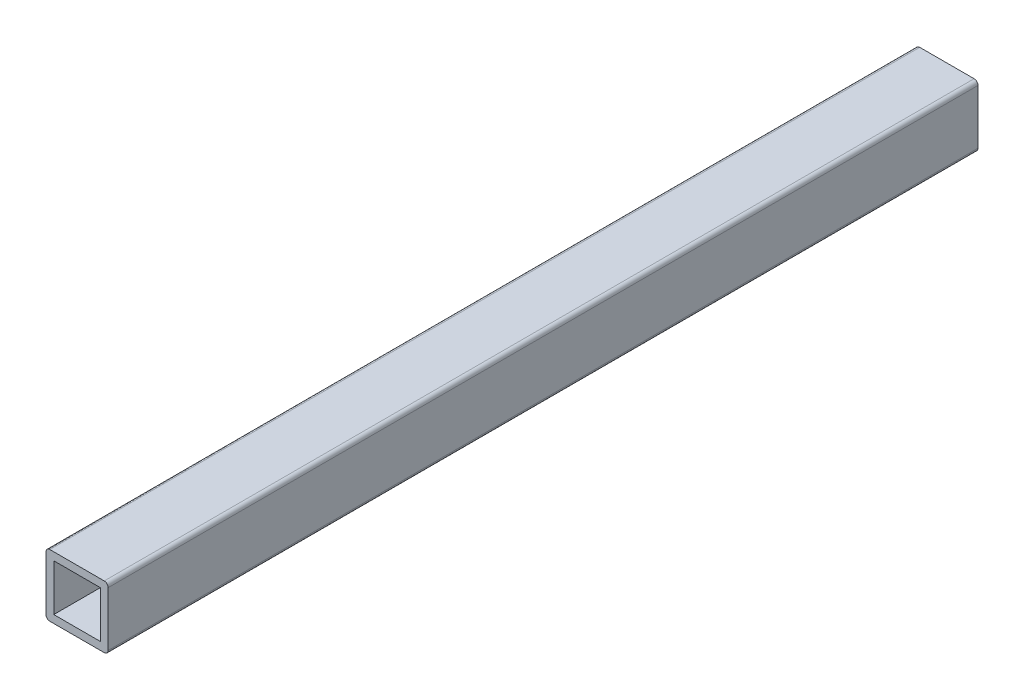
ISO-10303-21;
HEADER;
FILE_DESCRIPTION(('STEP AP214'),'2;1');
FILE_NAME('part.step','',(''),(''),'','','');
FILE_SCHEMA(('AUTOMOTIVE_DESIGN { 1 0 10303 214 1 1 1 1 }'));
ENDSEC;
DATA;
#1=APPLICATION_CONTEXT('core data for automotive mechanical design processes');
#2=APPLICATION_PROTOCOL_DEFINITION('international standard','automotive_design',2000,#1);
#3=PRODUCT_CONTEXT('',#1,'mechanical');
#4=PRODUCT('Part','Part','',(#3));
#5=PRODUCT_RELATED_PRODUCT_CATEGORY('part','',(#4));
#6=PRODUCT_DEFINITION_FORMATION('','',#4);
#7=PRODUCT_DEFINITION_CONTEXT('part definition',#1,'design');
#8=PRODUCT_DEFINITION('design','',#6,#7);
#9=PRODUCT_DEFINITION_SHAPE('','',#8);
#10=(LENGTH_UNIT() NAMED_UNIT(*) SI_UNIT(.MILLI.,.METRE.));
#11=(NAMED_UNIT(*) PLANE_ANGLE_UNIT() SI_UNIT($,.RADIAN.));
#12=(NAMED_UNIT(*) SI_UNIT($,.STERADIAN.) SOLID_ANGLE_UNIT());
#13=UNCERTAINTY_MEASURE_WITH_UNIT(LENGTH_MEASURE(1.E-05),#10,'distance_accuracy_value','');
#14=(GEOMETRIC_REPRESENTATION_CONTEXT(3) GLOBAL_UNCERTAINTY_ASSIGNED_CONTEXT((#13)) GLOBAL_UNIT_ASSIGNED_CONTEXT((#10,
#11,#12)) REPRESENTATION_CONTEXT('',''));
#15=CARTESIAN_POINT('',(0.,0.,0.));
#16=DIRECTION('',(0.,0.,1.));
#17=DIRECTION('',(1.,0.,0.));
#18=AXIS2_PLACEMENT_3D('',#15,#16,#17);
#19=CARTESIAN_POINT('',(0.,0.,88.9));
#20=DIRECTION('',(0.,0.,-1.));
#21=DIRECTION('',(-1.,0.,0.));
#22=AXIS2_PLACEMENT_3D('',#19,#20,#21);
#23=PLANE('',#22);
#24=DIRECTION('',(-1.,0.,0.));
#25=VECTOR('',#24,1.);
#26=CARTESIAN_POINT('',(-6.35,6.35,88.9));
#27=LINE('',#26,#25);
#28=CARTESIAN_POINT('',(5.55625,6.35,88.9));
#29=VERTEX_POINT('',#28);
#30=CARTESIAN_POINT('',(-5.55625,6.35,88.9));
#31=VERTEX_POINT('',#30);
#32=EDGE_CURVE('E181',#29,#31,#27,.T.);
#33=ORIENTED_EDGE('',*,*,#32,.T.);
#34=CARTESIAN_POINT('',(-5.55625,5.55625,88.9));
#35=DIRECTION('',(0.,0.,-1.));
#36=DIRECTION('',(-1.,0.,0.));
#37=AXIS2_PLACEMENT_3D('',#34,#35,#36);
#38=CIRCLE('',#37,0.79375);
#39=CARTESIAN_POINT('',(-6.35,5.55625,88.9));
#40=VERTEX_POINT('',#39);
#41=EDGE_CURVE('E211',#31,#40,#38,.F.);
#42=ORIENTED_EDGE('',*,*,#41,.T.);
#43=DIRECTION('',(0.,-1.,0.));
#44=VECTOR('',#43,1.);
#45=CARTESIAN_POINT('',(-6.35,-6.35,88.9));
#46=LINE('',#45,#44);
#47=CARTESIAN_POINT('',(-6.35,-5.55625,88.9));
#48=VERTEX_POINT('',#47);
#49=EDGE_CURVE('E184',#40,#48,#46,.T.);
#50=ORIENTED_EDGE('',*,*,#49,.T.);
#51=CARTESIAN_POINT('',(-5.55625,-5.55625,88.9));
#52=DIRECTION('',(0.,0.,-1.));
#53=DIRECTION('',(-1.,0.,0.));
#54=AXIS2_PLACEMENT_3D('',#51,#52,#53);
#55=CIRCLE('',#54,0.79375);
#56=CARTESIAN_POINT('',(-5.55625,-6.35,88.9));
#57=VERTEX_POINT('',#56);
#58=EDGE_CURVE('E55',#48,#57,#55,.F.);
#59=ORIENTED_EDGE('',*,*,#58,.T.);
#60=DIRECTION('',(1.,0.,0.));
#61=VECTOR('',#60,1.);
#62=CARTESIAN_POINT('',(-6.35,-6.35,88.9));
#63=LINE('',#62,#61);
#64=CARTESIAN_POINT('',(5.55625,-6.35,88.9));
#65=VERTEX_POINT('',#64);
#66=EDGE_CURVE('E186',#57,#65,#63,.T.);
#67=ORIENTED_EDGE('',*,*,#66,.T.);
#68=CARTESIAN_POINT('',(5.55624999999999,-5.55625,88.9));
#69=DIRECTION('',(0.,0.,-1.));
#70=DIRECTION('',(-1.,0.,0.));
#71=AXIS2_PLACEMENT_3D('',#68,#69,#70);
#72=CIRCLE('',#71,0.79375);
#73=CARTESIAN_POINT('',(6.34999999999999,-5.55625,88.9));
#74=VERTEX_POINT('',#73);
#75=EDGE_CURVE('E208',#65,#74,#72,.F.);
#76=ORIENTED_EDGE('',*,*,#75,.T.);
#77=DIRECTION('',(0.,1.,0.));
#78=VECTOR('',#77,1.);
#79=CARTESIAN_POINT('',(6.34999999999999,-6.35,88.9));
#80=LINE('',#79,#78);
#81=CARTESIAN_POINT('',(6.34999999999999,5.55625,88.9));
#82=VERTEX_POINT('',#81);
#83=EDGE_CURVE('E135',#74,#82,#80,.T.);
#84=ORIENTED_EDGE('',*,*,#83,.T.);
#85=CARTESIAN_POINT('',(5.55625,5.55625,88.9));
#86=DIRECTION('',(0.,0.,-1.));
#87=DIRECTION('',(-1.,0.,0.));
#88=AXIS2_PLACEMENT_3D('',#85,#86,#87);
#89=CIRCLE('',#88,0.79375);
#90=EDGE_CURVE('E206',#82,#29,#89,.F.);
#91=ORIENTED_EDGE('',*,*,#90,.T.);
#92=EDGE_LOOP('',(#33,#42,#50,#59,#67,#76,#84,#91));
#93=FACE_BOUND('',#92,.T.);
#94=DIRECTION('',(1.,0.,0.));
#95=VECTOR('',#94,1.);
#96=CARTESIAN_POINT('',(-4.7625,-4.7625,88.9));
#97=LINE('',#96,#95);
#98=CARTESIAN_POINT('',(-4.7625,-4.7625,88.9));
#99=VERTEX_POINT('',#98);
#100=CARTESIAN_POINT('',(4.76249999999999,-4.7625,88.9));
#101=VERTEX_POINT('',#100);
#102=EDGE_CURVE('E132',#99,#101,#97,.T.);
#103=ORIENTED_EDGE('',*,*,#102,.F.);
#104=DIRECTION('',(0.,-1.,0.));
#105=VECTOR('',#104,1.);
#106=CARTESIAN_POINT('',(-4.7625,-4.7625,88.9));
#107=LINE('',#106,#105);
#108=CARTESIAN_POINT('',(-4.7625,4.7625,88.9));
#109=VERTEX_POINT('',#108);
#110=EDGE_CURVE('E172',#109,#99,#107,.T.);
#111=ORIENTED_EDGE('',*,*,#110,.F.);
#112=DIRECTION('',(-1.,0.,0.));
#113=VECTOR('',#112,1.);
#114=CARTESIAN_POINT('',(-4.7625,4.7625,88.9));
#115=LINE('',#114,#113);
#116=CARTESIAN_POINT('',(4.76249999999999,4.7625,88.9));
#117=VERTEX_POINT('',#116);
#118=EDGE_CURVE('E169',#117,#109,#115,.T.);
#119=ORIENTED_EDGE('',*,*,#118,.F.);
#120=DIRECTION('',(0.,1.,0.));
#121=VECTOR('',#120,1.);
#122=CARTESIAN_POINT('',(4.76249999999999,-4.7625,88.9));
#123=LINE('',#122,#121);
#124=EDGE_CURVE('E167',#101,#117,#123,.T.);
#125=ORIENTED_EDGE('',*,*,#124,.F.);
#126=EDGE_LOOP('',(#103,#111,#119,#125));
#127=FACE_BOUND('',#126,.T.);
#128=ADVANCED_FACE('F33',(#93,#127),#23,.F.);
#129=CARTESIAN_POINT('',(6.34999999999999,-6.35,88.9));
#130=DIRECTION('',(-1.,0.,0.));
#131=DIRECTION('',(0.,0.,1.));
#132=AXIS2_PLACEMENT_3D('',#129,#130,#131);
#133=PLANE('',#132);
#134=ORIENTED_EDGE('',*,*,#83,.F.);
#135=DIRECTION('',(0.,0.,-1.));
#136=VECTOR('',#135,1.);
#137=CARTESIAN_POINT('',(6.34999999999999,-5.55625,88.9));
#138=LINE('',#137,#136);
#139=CARTESIAN_POINT('',(6.34999999999999,-5.55625,-88.9));
#140=VERTEX_POINT('',#139);
#141=EDGE_CURVE('E11',#74,#140,#138,.T.);
#142=ORIENTED_EDGE('',*,*,#141,.T.);
#143=DIRECTION('',(0.,1.,0.));
#144=VECTOR('',#143,1.);
#145=CARTESIAN_POINT('',(6.34999999999999,-6.35,-88.9));
#146=LINE('',#145,#144);
#147=CARTESIAN_POINT('',(6.34999999999999,5.55625,-88.9));
#148=VERTEX_POINT('',#147);
#149=EDGE_CURVE('E155',#140,#148,#146,.T.);
#150=ORIENTED_EDGE('',*,*,#149,.T.);
#151=DIRECTION('',(0.,0.,-1.));
#152=VECTOR('',#151,1.);
#153=CARTESIAN_POINT('',(6.34999999999999,5.55625,88.9));
#154=LINE('',#153,#152);
#155=EDGE_CURVE('E41',#148,#82,#154,.F.);
#156=ORIENTED_EDGE('',*,*,#155,.T.);
#157=EDGE_LOOP('',(#134,#142,#150,#156));
#158=FACE_BOUND('',#157,.T.);
#159=ADVANCED_FACE('F219',(#158),#133,.F.);
#160=CARTESIAN_POINT('',(-6.35,6.35,88.9));
#161=DIRECTION('',(0.,-1.,0.));
#162=DIRECTION('',(0.,0.,-1.));
#163=AXIS2_PLACEMENT_3D('',#160,#161,#162);
#164=PLANE('',#163);
#165=DIRECTION('',(-1.,0.,0.));
#166=VECTOR('',#165,1.);
#167=CARTESIAN_POINT('',(-6.35,6.35,-88.9));
#168=LINE('',#167,#166);
#169=CARTESIAN_POINT('',(5.55625,6.35,-88.9));
#170=VERTEX_POINT('',#169);
#171=CARTESIAN_POINT('',(-5.55625,6.35,-88.9));
#172=VERTEX_POINT('',#171);
#173=EDGE_CURVE('E158',#170,#172,#168,.T.);
#174=ORIENTED_EDGE('',*,*,#173,.T.);
#175=DIRECTION('',(0.,0.,-1.));
#176=VECTOR('',#175,1.);
#177=CARTESIAN_POINT('',(-5.55625,6.35,88.9));
#178=LINE('',#177,#176);
#179=EDGE_CURVE('E204',#172,#31,#178,.F.);
#180=ORIENTED_EDGE('',*,*,#179,.T.);
#181=ORIENTED_EDGE('',*,*,#32,.F.);
#182=DIRECTION('',(0.,0.,-1.));
#183=VECTOR('',#182,1.);
#184=CARTESIAN_POINT('',(5.55625,6.35,88.9));
#185=LINE('',#184,#183);
#186=EDGE_CURVE('E201',#29,#170,#185,.T.);
#187=ORIENTED_EDGE('',*,*,#186,.T.);
#188=EDGE_LOOP('',(#174,#180,#181,#187));
#189=FACE_BOUND('',#188,.T.);
#190=ADVANCED_FACE('F230',(#189),#164,.F.);
#191=CARTESIAN_POINT('',(-6.35,-6.35,88.9));
#192=DIRECTION('',(1.,0.,0.));
#193=DIRECTION('',(0.,0.,-1.));
#194=AXIS2_PLACEMENT_3D('',#191,#192,#193);
#195=PLANE('',#194);
#196=ORIENTED_EDGE('',*,*,#49,.F.);
#197=DIRECTION('',(0.,0.,-1.));
#198=VECTOR('',#197,1.);
#199=CARTESIAN_POINT('',(-6.35,5.55625,88.9));
#200=LINE('',#199,#198);
#201=CARTESIAN_POINT('',(-6.35,5.55625,-88.9));
#202=VERTEX_POINT('',#201);
#203=EDGE_CURVE('E190',#40,#202,#200,.T.);
#204=ORIENTED_EDGE('',*,*,#203,.T.);
#205=DIRECTION('',(0.,-1.,0.));
#206=VECTOR('',#205,1.);
#207=CARTESIAN_POINT('',(-6.35,-6.35,-88.9));
#208=LINE('',#207,#206);
#209=CARTESIAN_POINT('',(-6.35,-5.55625,-88.9));
#210=VERTEX_POINT('',#209);
#211=EDGE_CURVE('E161',#202,#210,#208,.T.);
#212=ORIENTED_EDGE('',*,*,#211,.T.);
#213=DIRECTION('',(0.,0.,-1.));
#214=VECTOR('',#213,1.);
#215=CARTESIAN_POINT('',(-6.35,-5.55625,88.9));
#216=LINE('',#215,#214);
#217=EDGE_CURVE('E188',#210,#48,#216,.F.);
#218=ORIENTED_EDGE('',*,*,#217,.T.);
#219=EDGE_LOOP('',(#196,#204,#212,#218));
#220=FACE_BOUND('',#219,.T.);
#221=ADVANCED_FACE('F239',(#220),#195,.F.);
#222=CARTESIAN_POINT('',(-6.35,-6.35,88.9));
#223=DIRECTION('',(0.,1.,0.));
#224=DIRECTION('',(0.,0.,1.));
#225=AXIS2_PLACEMENT_3D('',#222,#223,#224);
#226=PLANE('',#225);
#227=ORIENTED_EDGE('',*,*,#66,.F.);
#228=DIRECTION('',(0.,0.,-1.));
#229=VECTOR('',#228,1.);
#230=CARTESIAN_POINT('',(-5.55625,-6.35,88.9));
#231=LINE('',#230,#229);
#232=CARTESIAN_POINT('',(-5.55625,-6.35,-88.9));
#233=VERTEX_POINT('',#232);
#234=EDGE_CURVE('E214',#57,#233,#231,.T.);
#235=ORIENTED_EDGE('',*,*,#234,.T.);
#236=DIRECTION('',(1.,0.,0.));
#237=VECTOR('',#236,1.);
#238=CARTESIAN_POINT('',(-6.35,-6.35,-88.9));
#239=LINE('',#238,#237);
#240=CARTESIAN_POINT('',(5.55625,-6.35,-88.9));
#241=VERTEX_POINT('',#240);
#242=EDGE_CURVE('E164',#233,#241,#239,.T.);
#243=ORIENTED_EDGE('',*,*,#242,.T.);
#244=DIRECTION('',(0.,0.,-1.));
#245=VECTOR('',#244,1.);
#246=CARTESIAN_POINT('',(5.55625,-6.35,88.9));
#247=LINE('',#246,#245);
#248=EDGE_CURVE('E48',#241,#65,#247,.F.);
#249=ORIENTED_EDGE('',*,*,#248,.T.);
#250=EDGE_LOOP('',(#227,#235,#243,#249));
#251=FACE_BOUND('',#250,.T.);
#252=ADVANCED_FACE('F245',(#251),#226,.F.);
#253=CARTESIAN_POINT('',(-4.7625,-4.7625,88.9));
#254=DIRECTION('',(0.,1.,0.));
#255=DIRECTION('',(0.,0.,1.));
#256=AXIS2_PLACEMENT_3D('',#253,#254,#255);
#257=PLANE('',#256);
#258=DIRECTION('',(0.,0.,-1.));
#259=VECTOR('',#258,1.);
#260=CARTESIAN_POINT('',(4.76249999999999,-4.7625,88.9));
#261=LINE('',#260,#259);
#262=CARTESIAN_POINT('',(4.76249999999999,-4.7625,-88.9));
#263=VERTEX_POINT('',#262);
#264=EDGE_CURVE('E124',#101,#263,#261,.T.);
#265=ORIENTED_EDGE('',*,*,#264,.T.);
#266=DIRECTION('',(1.,0.,0.));
#267=VECTOR('',#266,1.);
#268=CARTESIAN_POINT('',(-4.7625,-4.7625,-88.9));
#269=LINE('',#268,#267);
#270=CARTESIAN_POINT('',(-4.7625,-4.7625,-88.9));
#271=VERTEX_POINT('',#270);
#272=EDGE_CURVE('E129',#271,#263,#269,.T.);
#273=ORIENTED_EDGE('',*,*,#272,.F.);
#274=DIRECTION('',(0.,0.,-1.));
#275=VECTOR('',#274,1.);
#276=CARTESIAN_POINT('',(-4.7625,-4.7625,88.9));
#277=LINE('',#276,#275);
#278=EDGE_CURVE('E174',#99,#271,#277,.T.);
#279=ORIENTED_EDGE('',*,*,#278,.F.);
#280=ORIENTED_EDGE('',*,*,#102,.T.);
#281=EDGE_LOOP('',(#265,#273,#279,#280));
#282=FACE_BOUND('',#281,.T.);
#283=ADVANCED_FACE('F126',(#282),#257,.T.);
#284=CARTESIAN_POINT('',(4.76249999999999,-4.7625,88.9));
#285=DIRECTION('',(-1.,0.,0.));
#286=DIRECTION('',(0.,0.,1.));
#287=AXIS2_PLACEMENT_3D('',#284,#285,#286);
#288=PLANE('',#287);
#289=DIRECTION('',(0.,0.,-1.));
#290=VECTOR('',#289,1.);
#291=CARTESIAN_POINT('',(4.76249999999999,4.7625,88.9));
#292=LINE('',#291,#290);
#293=CARTESIAN_POINT('',(4.76249999999999,4.7625,-88.9));
#294=VERTEX_POINT('',#293);
#295=EDGE_CURVE('E136',#117,#294,#292,.T.);
#296=ORIENTED_EDGE('',*,*,#295,.T.);
#297=DIRECTION('',(0.,1.,0.));
#298=VECTOR('',#297,1.);
#299=CARTESIAN_POINT('',(4.76249999999999,-4.7625,-88.9));
#300=LINE('',#299,#298);
#301=EDGE_CURVE('E139',#263,#294,#300,.T.);
#302=ORIENTED_EDGE('',*,*,#301,.F.);
#303=ORIENTED_EDGE('',*,*,#264,.F.);
#304=ORIENTED_EDGE('',*,*,#124,.T.);
#305=EDGE_LOOP('',(#296,#302,#303,#304));
#306=FACE_BOUND('',#305,.T.);
#307=ADVANCED_FACE('F140',(#306),#288,.T.);
#308=CARTESIAN_POINT('',(-4.7625,4.7625,88.9));
#309=DIRECTION('',(0.,-1.,0.));
#310=DIRECTION('',(0.,0.,-1.));
#311=AXIS2_PLACEMENT_3D('',#308,#309,#310);
#312=PLANE('',#311);
#313=DIRECTION('',(0.,0.,-1.));
#314=VECTOR('',#313,1.);
#315=CARTESIAN_POINT('',(-4.7625,4.7625,88.9));
#316=LINE('',#315,#314);
#317=CARTESIAN_POINT('',(-4.7625,4.7625,-88.9));
#318=VERTEX_POINT('',#317);
#319=EDGE_CURVE('E176',#109,#318,#316,.T.);
#320=ORIENTED_EDGE('',*,*,#319,.T.);
#321=DIRECTION('',(-1.,0.,0.));
#322=VECTOR('',#321,1.);
#323=CARTESIAN_POINT('',(-4.7625,4.7625,-88.9));
#324=LINE('',#323,#322);
#325=EDGE_CURVE('E145',#294,#318,#324,.T.);
#326=ORIENTED_EDGE('',*,*,#325,.F.);
#327=ORIENTED_EDGE('',*,*,#295,.F.);
#328=ORIENTED_EDGE('',*,*,#118,.T.);
#329=EDGE_LOOP('',(#320,#326,#327,#328));
#330=FACE_BOUND('',#329,.T.);
#331=ADVANCED_FACE('F278',(#330),#312,.T.);
#332=CARTESIAN_POINT('',(-4.7625,-4.7625,88.9));
#333=DIRECTION('',(1.,0.,0.));
#334=DIRECTION('',(0.,0.,-1.));
#335=AXIS2_PLACEMENT_3D('',#332,#333,#334);
#336=PLANE('',#335);
#337=ORIENTED_EDGE('',*,*,#278,.T.);
#338=DIRECTION('',(0.,-1.,0.));
#339=VECTOR('',#338,1.);
#340=CARTESIAN_POINT('',(-4.7625,-4.7625,-88.9));
#341=LINE('',#340,#339);
#342=EDGE_CURVE('E150',#318,#271,#341,.T.);
#343=ORIENTED_EDGE('',*,*,#342,.F.);
#344=ORIENTED_EDGE('',*,*,#319,.F.);
#345=ORIENTED_EDGE('',*,*,#110,.T.);
#346=EDGE_LOOP('',(#337,#343,#344,#345));
#347=FACE_BOUND('',#346,.T.);
#348=ADVANCED_FACE('F273',(#347),#336,.T.);
#349=CARTESIAN_POINT('',(0.,0.,-88.9));
#350=DIRECTION('',(0.,0.,-1.));
#351=DIRECTION('',(-1.,0.,0.));
#352=AXIS2_PLACEMENT_3D('',#349,#350,#351);
#353=PLANE('',#352);
#354=ORIENTED_EDGE('',*,*,#272,.T.);
#355=ORIENTED_EDGE('',*,*,#301,.T.);
#356=ORIENTED_EDGE('',*,*,#325,.T.);
#357=ORIENTED_EDGE('',*,*,#342,.T.);
#358=EDGE_LOOP('',(#354,#355,#356,#357));
#359=FACE_BOUND('',#358,.T.);
#360=ORIENTED_EDGE('',*,*,#211,.F.);
#361=CARTESIAN_POINT('',(-5.55625,5.55625,-88.9));
#362=DIRECTION('',(0.,0.,-1.));
#363=DIRECTION('',(-1.,0.,0.));
#364=AXIS2_PLACEMENT_3D('',#361,#362,#363);
#365=CIRCLE('',#364,0.79375);
#366=EDGE_CURVE('E199',#202,#172,#365,.T.);
#367=ORIENTED_EDGE('',*,*,#366,.T.);
#368=ORIENTED_EDGE('',*,*,#173,.F.);
#369=CARTESIAN_POINT('',(5.55625,5.55625,-88.9));
#370=DIRECTION('',(0.,0.,-1.));
#371=DIRECTION('',(-1.,0.,0.));
#372=AXIS2_PLACEMENT_3D('',#369,#370,#371);
#373=CIRCLE('',#372,0.79375);
#374=EDGE_CURVE('E193',#170,#148,#373,.T.);
#375=ORIENTED_EDGE('',*,*,#374,.T.);
#376=ORIENTED_EDGE('',*,*,#149,.F.);
#377=CARTESIAN_POINT('',(5.55624999999999,-5.55625,-88.9));
#378=DIRECTION('',(0.,0.,-1.));
#379=DIRECTION('',(-1.,0.,0.));
#380=AXIS2_PLACEMENT_3D('',#377,#378,#379);
#381=CIRCLE('',#380,0.79375);
#382=EDGE_CURVE('E195',#140,#241,#381,.T.);
#383=ORIENTED_EDGE('',*,*,#382,.T.);
#384=ORIENTED_EDGE('',*,*,#242,.F.);
#385=CARTESIAN_POINT('',(-5.55625,-5.55625,-88.9));
#386=DIRECTION('',(0.,0.,-1.));
#387=DIRECTION('',(-1.,0.,0.));
#388=AXIS2_PLACEMENT_3D('',#385,#386,#387);
#389=CIRCLE('',#388,0.79375);
#390=EDGE_CURVE('E197',#233,#210,#389,.T.);
#391=ORIENTED_EDGE('',*,*,#390,.T.);
#392=EDGE_LOOP('',(#360,#367,#368,#375,#376,#383,#384,#391));
#393=FACE_BOUND('',#392,.T.);
#394=ADVANCED_FACE('F147',(#359,#393),#353,.T.);
#395=CARTESIAN_POINT('',(-5.55625,5.55625,88.9));
#396=DIRECTION('',(0.,0.,-1.));
#397=DIRECTION('',(-1.,0.,0.));
#398=AXIS2_PLACEMENT_3D('',#395,#396,#397);
#399=CYLINDRICAL_SURFACE('',#398,0.79375);
#400=ORIENTED_EDGE('',*,*,#41,.F.);
#401=ORIENTED_EDGE('',*,*,#179,.F.);
#402=ORIENTED_EDGE('',*,*,#366,.F.);
#403=ORIENTED_EDGE('',*,*,#203,.F.);
#404=EDGE_LOOP('',(#400,#401,#402,#403));
#405=FACE_BOUND('',#404,.T.);
#406=ADVANCED_FACE('F236',(#405),#399,.T.);
#407=CARTESIAN_POINT('',(-5.55625,-5.55625,88.9));
#408=DIRECTION('',(0.,0.,-1.));
#409=DIRECTION('',(-1.,0.,0.));
#410=AXIS2_PLACEMENT_3D('',#407,#408,#409);
#411=CYLINDRICAL_SURFACE('',#410,0.79375);
#412=ORIENTED_EDGE('',*,*,#58,.F.);
#413=ORIENTED_EDGE('',*,*,#217,.F.);
#414=ORIENTED_EDGE('',*,*,#390,.F.);
#415=ORIENTED_EDGE('',*,*,#234,.F.);
#416=EDGE_LOOP('',(#412,#413,#414,#415));
#417=FACE_BOUND('',#416,.T.);
#418=ADVANCED_FACE('F243',(#417),#411,.T.);
#419=CARTESIAN_POINT('',(5.55624999999999,-5.55625,88.9));
#420=DIRECTION('',(0.,0.,-1.));
#421=DIRECTION('',(-1.,0.,0.));
#422=AXIS2_PLACEMENT_3D('',#419,#420,#421);
#423=CYLINDRICAL_SURFACE('',#422,0.79375);
#424=ORIENTED_EDGE('',*,*,#75,.F.);
#425=ORIENTED_EDGE('',*,*,#248,.F.);
#426=ORIENTED_EDGE('',*,*,#382,.F.);
#427=ORIENTED_EDGE('',*,*,#141,.F.);
#428=EDGE_LOOP('',(#424,#425,#426,#427));
#429=FACE_BOUND('',#428,.T.);
#430=ADVANCED_FACE('F247',(#429),#423,.T.);
#431=CARTESIAN_POINT('',(5.55625,5.55625,88.9));
#432=DIRECTION('',(0.,0.,-1.));
#433=DIRECTION('',(-1.,0.,0.));
#434=AXIS2_PLACEMENT_3D('',#431,#432,#433);
#435=CYLINDRICAL_SURFACE('',#434,0.79375);
#436=ORIENTED_EDGE('',*,*,#90,.F.);
#437=ORIENTED_EDGE('',*,*,#155,.F.);
#438=ORIENTED_EDGE('',*,*,#374,.F.);
#439=ORIENTED_EDGE('',*,*,#186,.F.);
#440=EDGE_LOOP('',(#436,#437,#438,#439));
#441=FACE_BOUND('',#440,.T.);
#442=ADVANCED_FACE('F35',(#441),#435,.T.);
#443=CLOSED_SHELL('',(#128,#159,#190,#221,#252,#283,#307,#331,#348,#394,#406,#418,#430,#442));
#444=MANIFOLD_SOLID_BREP('B2',#443);
#445=ADVANCED_BREP_SHAPE_REPRESENTATION('',(#18,#444),#14);
#446=SHAPE_DEFINITION_REPRESENTATION(#9,#445);
ENDSEC;
END-ISO-10303-21;
